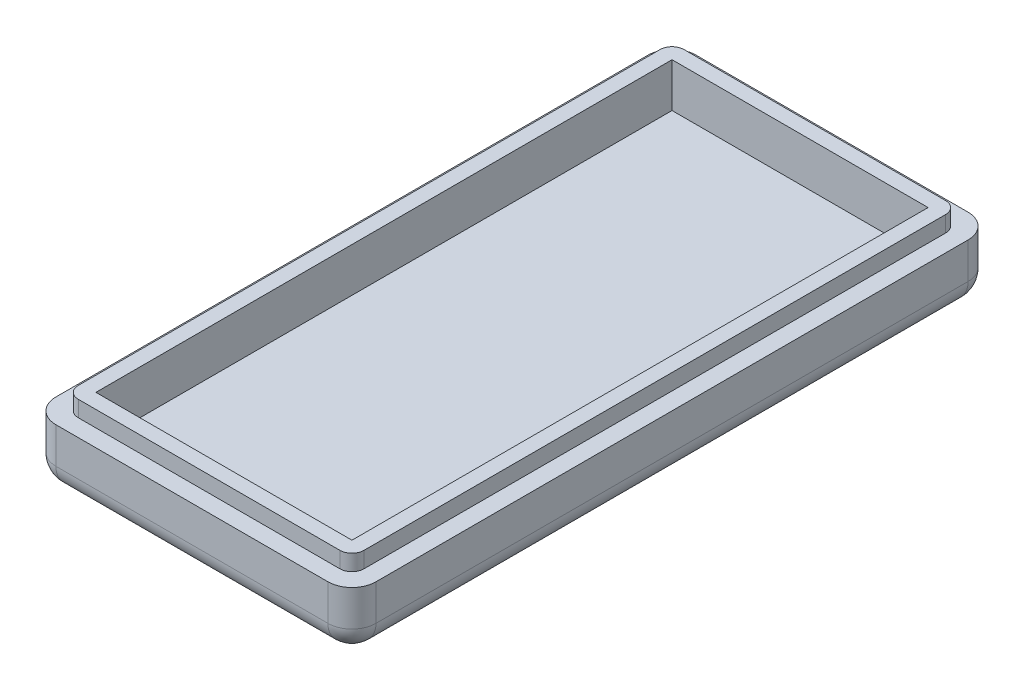
ISO-10303-21;
HEADER;
FILE_DESCRIPTION(('STEP AP214'),'2;1');
FILE_NAME('part.step','',(''),(''),'','','');
FILE_SCHEMA(('AUTOMOTIVE_DESIGN { 1 0 10303 214 1 1 1 1 }'));
ENDSEC;
DATA;
#1=APPLICATION_CONTEXT('core data for automotive mechanical design processes');
#2=APPLICATION_PROTOCOL_DEFINITION('international standard','automotive_design',2000,#1);
#3=PRODUCT_CONTEXT('',#1,'mechanical');
#4=PRODUCT('Part','Part','',(#3));
#5=PRODUCT_RELATED_PRODUCT_CATEGORY('part','',(#4));
#6=PRODUCT_DEFINITION_FORMATION('','',#4);
#7=PRODUCT_DEFINITION_CONTEXT('part definition',#1,'design');
#8=PRODUCT_DEFINITION('design','',#6,#7);
#9=PRODUCT_DEFINITION_SHAPE('','',#8);
#10=(LENGTH_UNIT() NAMED_UNIT(*) SI_UNIT(.MILLI.,.METRE.));
#11=(NAMED_UNIT(*) PLANE_ANGLE_UNIT() SI_UNIT($,.RADIAN.));
#12=(NAMED_UNIT(*) SI_UNIT($,.STERADIAN.) SOLID_ANGLE_UNIT());
#13=UNCERTAINTY_MEASURE_WITH_UNIT(LENGTH_MEASURE(1.E-05),#10,'distance_accuracy_value','');
#14=(GEOMETRIC_REPRESENTATION_CONTEXT(3) GLOBAL_UNCERTAINTY_ASSIGNED_CONTEXT((#13)) GLOBAL_UNIT_ASSIGNED_CONTEXT((#10,
#11,#12)) REPRESENTATION_CONTEXT('',''));
#15=CARTESIAN_POINT('',(0.,0.,0.));
#16=DIRECTION('',(0.,0.,1.));
#17=DIRECTION('',(1.,0.,0.));
#18=AXIS2_PLACEMENT_3D('',#15,#16,#17);
#19=CARTESIAN_POINT('',(0.,7.5,80.));
#20=DIRECTION('',(0.,-1.,0.));
#21=DIRECTION('',(0.,0.,-1.));
#22=AXIS2_PLACEMENT_3D('',#19,#20,#21);
#23=PLANE('',#22);
#24=DIRECTION('',(-1.,0.,0.));
#25=VECTOR('',#24,1.);
#26=CARTESIAN_POINT('',(0.,7.5,0.));
#27=LINE('',#26,#25);
#28=CARTESIAN_POINT('',(37.,7.5,0.));
#29=VERTEX_POINT('',#28);
#30=CARTESIAN_POINT('',(3.,7.5,0.));
#31=VERTEX_POINT('',#30);
#32=EDGE_CURVE('E283',#29,#31,#27,.T.);
#33=ORIENTED_EDGE('',*,*,#32,.T.);
#34=CARTESIAN_POINT('',(3.,7.5,3.));
#35=DIRECTION('',(0.,-1.,0.));
#36=DIRECTION('',(0.,0.,-1.));
#37=AXIS2_PLACEMENT_3D('',#34,#35,#36);
#38=CIRCLE('',#37,3.);
#39=CARTESIAN_POINT('',(0.,7.5,3.));
#40=VERTEX_POINT('',#39);
#41=EDGE_CURVE('E322',#31,#40,#38,.F.);
#42=ORIENTED_EDGE('',*,*,#41,.T.);
#43=DIRECTION('',(0.,0.,-1.));
#44=VECTOR('',#43,1.);
#45=CARTESIAN_POINT('',(0.,7.5,80.));
#46=LINE('',#45,#44);
#47=CARTESIAN_POINT('',(0.,7.5,77.));
#48=VERTEX_POINT('',#47);
#49=EDGE_CURVE('E295',#48,#40,#46,.T.);
#50=ORIENTED_EDGE('',*,*,#49,.F.);
#51=CARTESIAN_POINT('',(3.,7.5,77.));
#52=DIRECTION('',(0.,-1.,0.));
#53=DIRECTION('',(0.,0.,-1.));
#54=AXIS2_PLACEMENT_3D('',#51,#52,#53);
#55=CIRCLE('',#54,3.);
#56=CARTESIAN_POINT('',(3.,7.5,80.));
#57=VERTEX_POINT('',#56);
#58=EDGE_CURVE('E320',#48,#57,#55,.F.);
#59=ORIENTED_EDGE('',*,*,#58,.T.);
#60=DIRECTION('',(-1.,0.,0.));
#61=VECTOR('',#60,1.);
#62=CARTESIAN_POINT('',(0.,7.5,80.));
#63=LINE('',#62,#61);
#64=CARTESIAN_POINT('',(37.,7.5,80.));
#65=VERTEX_POINT('',#64);
#66=EDGE_CURVE('E292',#65,#57,#63,.T.);
#67=ORIENTED_EDGE('',*,*,#66,.F.);
#68=CARTESIAN_POINT('',(37.,7.5,77.));
#69=DIRECTION('',(0.,-1.,0.));
#70=DIRECTION('',(0.,0.,-1.));
#71=AXIS2_PLACEMENT_3D('',#68,#69,#70);
#72=CIRCLE('',#71,3.);
#73=CARTESIAN_POINT('',(40.,7.5,77.));
#74=VERTEX_POINT('',#73);
#75=EDGE_CURVE('E318',#65,#74,#72,.F.);
#76=ORIENTED_EDGE('',*,*,#75,.T.);
#77=DIRECTION('',(0.,0.,-1.));
#78=VECTOR('',#77,1.);
#79=CARTESIAN_POINT('',(40.,7.5,80.));
#80=LINE('',#79,#78);
#81=CARTESIAN_POINT('',(40.,7.5,3.));
#82=VERTEX_POINT('',#81);
#83=EDGE_CURVE('E300',#74,#82,#80,.T.);
#84=ORIENTED_EDGE('',*,*,#83,.T.);
#85=CARTESIAN_POINT('',(37.,7.5,3.));
#86=DIRECTION('',(0.,-1.,0.));
#87=DIRECTION('',(0.,0.,-1.));
#88=AXIS2_PLACEMENT_3D('',#85,#86,#87);
#89=CIRCLE('',#88,3.);
#90=EDGE_CURVE('E316',#82,#29,#89,.F.);
#91=ORIENTED_EDGE('',*,*,#90,.T.);
#92=EDGE_LOOP('',(#33,#42,#50,#59,#67,#76,#84,#91));
#93=FACE_BOUND('',#92,.T.);
#94=CARTESIAN_POINT('',(3.65,7.5,76.35));
#95=DIRECTION('',(0.,1.,0.));
#96=DIRECTION('',(0.,0.,1.));
#97=AXIS2_PLACEMENT_3D('',#94,#95,#96);
#98=CIRCLE('',#97,1.5);
#99=CARTESIAN_POINT('',(2.15,7.5,76.35));
#100=VERTEX_POINT('',#99);
#101=CARTESIAN_POINT('',(3.65,7.5,77.85));
#102=VERTEX_POINT('',#101);
#103=EDGE_CURVE('E56',#100,#102,#98,.T.);
#104=ORIENTED_EDGE('',*,*,#103,.F.);
#105=DIRECTION('',(0.,0.,1.));
#106=VECTOR('',#105,1.);
#107=CARTESIAN_POINT('',(2.14999999999999,7.5,3.65000000000001));
#108=LINE('',#107,#106);
#109=CARTESIAN_POINT('',(2.14999999999999,7.5,3.65000000000001));
#110=VERTEX_POINT('',#109);
#111=EDGE_CURVE('E60',#110,#100,#108,.T.);
#112=ORIENTED_EDGE('',*,*,#111,.F.);
#113=CARTESIAN_POINT('',(3.64999999999999,7.5,3.65000000000001));
#114=DIRECTION('',(0.,1.,0.));
#115=DIRECTION('',(0.,0.,-1.));
#116=AXIS2_PLACEMENT_3D('',#113,#114,#115);
#117=CIRCLE('',#116,1.5);
#118=CARTESIAN_POINT('',(3.64999999999999,7.5,2.15000000000001));
#119=VERTEX_POINT('',#118);
#120=EDGE_CURVE('E251',#119,#110,#117,.T.);
#121=ORIENTED_EDGE('',*,*,#120,.F.);
#122=DIRECTION('',(-1.,0.,0.));
#123=VECTOR('',#122,1.);
#124=CARTESIAN_POINT('',(36.35,7.5,2.15));
#125=LINE('',#124,#123);
#126=CARTESIAN_POINT('',(36.35,7.5,2.15));
#127=VERTEX_POINT('',#126);
#128=EDGE_CURVE('E248',#127,#119,#125,.T.);
#129=ORIENTED_EDGE('',*,*,#128,.F.);
#130=CARTESIAN_POINT('',(36.35,7.5,3.65));
#131=DIRECTION('',(0.,1.,0.));
#132=DIRECTION('',(0.,0.,-1.));
#133=AXIS2_PLACEMENT_3D('',#130,#131,#132);
#134=CIRCLE('',#133,1.5);
#135=CARTESIAN_POINT('',(37.85,7.5,3.65));
#136=VERTEX_POINT('',#135);
#137=EDGE_CURVE('E245',#136,#127,#134,.T.);
#138=ORIENTED_EDGE('',*,*,#137,.F.);
#139=DIRECTION('',(0.,0.,-1.));
#140=VECTOR('',#139,1.);
#141=CARTESIAN_POINT('',(37.85,7.5,76.35));
#142=LINE('',#141,#140);
#143=CARTESIAN_POINT('',(37.85,7.5,76.35));
#144=VERTEX_POINT('',#143);
#145=EDGE_CURVE('E242',#144,#136,#142,.T.);
#146=ORIENTED_EDGE('',*,*,#145,.F.);
#147=CARTESIAN_POINT('',(36.35,7.5,76.35));
#148=DIRECTION('',(0.,1.,0.));
#149=DIRECTION('',(0.,0.,-1.));
#150=AXIS2_PLACEMENT_3D('',#147,#148,#149);
#151=CIRCLE('',#150,1.5);
#152=CARTESIAN_POINT('',(36.35,7.5,77.85));
#153=VERTEX_POINT('',#152);
#154=EDGE_CURVE('E239',#153,#144,#151,.T.);
#155=ORIENTED_EDGE('',*,*,#154,.F.);
#156=DIRECTION('',(1.,0.,0.));
#157=VECTOR('',#156,1.);
#158=CARTESIAN_POINT('',(3.65,7.5,77.85));
#159=LINE('',#158,#157);
#160=EDGE_CURVE('E236',#102,#153,#159,.T.);
#161=ORIENTED_EDGE('',*,*,#160,.F.);
#162=EDGE_LOOP('',(#104,#112,#121,#129,#138,#146,#155,#161));
#163=FACE_BOUND('',#162,.T.);
#164=ADVANCED_FACE('F39',(#93,#163),#23,.F.);
#165=CARTESIAN_POINT('',(0.,0.,80.));
#166=DIRECTION('',(1.,0.,0.));
#167=DIRECTION('',(0.,0.,-1.));
#168=AXIS2_PLACEMENT_3D('',#165,#166,#167);
#169=PLANE('',#168);
#170=ORIENTED_EDGE('',*,*,#49,.T.);
#171=DIRECTION('',(0.,-1.,0.));
#172=VECTOR('',#171,1.);
#173=CARTESIAN_POINT('',(0.,0.,3.));
#174=LINE('',#173,#172);
#175=CARTESIAN_POINT('',(0.,3.,3.));
#176=VERTEX_POINT('',#175);
#177=EDGE_CURVE('E307',#40,#176,#174,.T.);
#178=ORIENTED_EDGE('',*,*,#177,.T.);
#179=DIRECTION('',(0.,0.,-1.));
#180=VECTOR('',#179,1.);
#181=CARTESIAN_POINT('',(0.,3.,80.));
#182=LINE('',#181,#180);
#183=CARTESIAN_POINT('',(0.,3.,77.));
#184=VERTEX_POINT('',#183);
#185=EDGE_CURVE('E303',#176,#184,#182,.F.);
#186=ORIENTED_EDGE('',*,*,#185,.T.);
#187=DIRECTION('',(0.,-1.,0.));
#188=VECTOR('',#187,1.);
#189=CARTESIAN_POINT('',(0.,0.,77.));
#190=LINE('',#189,#188);
#191=EDGE_CURVE('E305',#184,#48,#190,.F.);
#192=ORIENTED_EDGE('',*,*,#191,.T.);
#193=EDGE_LOOP('',(#170,#178,#186,#192));
#194=FACE_BOUND('',#193,.T.);
#195=ADVANCED_FACE('F440',(#194),#169,.F.);
#196=CARTESIAN_POINT('',(0.,0.,80.));
#197=DIRECTION('',(0.,1.,0.));
#198=DIRECTION('',(0.,0.,1.));
#199=AXIS2_PLACEMENT_3D('',#196,#197,#198);
#200=PLANE('',#199);
#201=DIRECTION('',(1.,0.,0.));
#202=VECTOR('',#201,1.);
#203=CARTESIAN_POINT('',(0.,0.,77.));
#204=LINE('',#203,#202);
#205=CARTESIAN_POINT('',(37.,0.,77.));
#206=VERTEX_POINT('',#205);
#207=CARTESIAN_POINT('',(3.,0.,77.));
#208=VERTEX_POINT('',#207);
#209=EDGE_CURVE('E326',#206,#208,#204,.F.);
#210=ORIENTED_EDGE('',*,*,#209,.T.);
#211=DIRECTION('',(0.,0.,-1.));
#212=VECTOR('',#211,1.);
#213=CARTESIAN_POINT('',(3.,0.,80.));
#214=LINE('',#213,#212);
#215=CARTESIAN_POINT('',(3.,0.,3.));
#216=VERTEX_POINT('',#215);
#217=EDGE_CURVE('E331',#208,#216,#214,.T.);
#218=ORIENTED_EDGE('',*,*,#217,.T.);
#219=DIRECTION('',(1.,0.,0.));
#220=VECTOR('',#219,1.);
#221=CARTESIAN_POINT('',(40.,0.,3.));
#222=LINE('',#221,#220);
#223=CARTESIAN_POINT('',(37.,0.,3.));
#224=VERTEX_POINT('',#223);
#225=EDGE_CURVE('E328',#216,#224,#222,.T.);
#226=ORIENTED_EDGE('',*,*,#225,.T.);
#227=DIRECTION('',(0.,0.,-1.));
#228=VECTOR('',#227,1.);
#229=CARTESIAN_POINT('',(37.,0.,80.));
#230=LINE('',#229,#228);
#231=EDGE_CURVE('E324',#224,#206,#230,.F.);
#232=ORIENTED_EDGE('',*,*,#231,.T.);
#233=EDGE_LOOP('',(#210,#218,#226,#232));
#234=FACE_BOUND('',#233,.T.);
#235=ADVANCED_FACE('F408',(#234),#200,.F.);
#236=CARTESIAN_POINT('',(40.,0.,80.));
#237=DIRECTION('',(-1.,0.,0.));
#238=DIRECTION('',(0.,0.,1.));
#239=AXIS2_PLACEMENT_3D('',#236,#237,#238);
#240=PLANE('',#239);
#241=ORIENTED_EDGE('',*,*,#83,.F.);
#242=DIRECTION('',(0.,1.,0.));
#243=VECTOR('',#242,1.);
#244=CARTESIAN_POINT('',(40.,0.,77.));
#245=LINE('',#244,#243);
#246=CARTESIAN_POINT('',(40.,3.,77.));
#247=VERTEX_POINT('',#246);
#248=EDGE_CURVE('E11',#74,#247,#245,.F.);
#249=ORIENTED_EDGE('',*,*,#248,.T.);
#250=DIRECTION('',(0.,0.,-1.));
#251=VECTOR('',#250,1.);
#252=CARTESIAN_POINT('',(40.,3.,80.));
#253=LINE('',#252,#251);
#254=CARTESIAN_POINT('',(40.,3.,3.));
#255=VERTEX_POINT('',#254);
#256=EDGE_CURVE('E48',#247,#255,#253,.T.);
#257=ORIENTED_EDGE('',*,*,#256,.T.);
#258=DIRECTION('',(0.,1.,0.));
#259=VECTOR('',#258,1.);
#260=CARTESIAN_POINT('',(40.,7.5,3.));
#261=LINE('',#260,#259);
#262=EDGE_CURVE('E339',#255,#82,#261,.T.);
#263=ORIENTED_EDGE('',*,*,#262,.T.);
#264=EDGE_LOOP('',(#241,#249,#257,#263));
#265=FACE_BOUND('',#264,.T.);
#266=ADVANCED_FACE('F424',(#265),#240,.F.);
#267=CARTESIAN_POINT('',(0.,0.,80.));
#268=DIRECTION('',(0.,0.,-1.));
#269=DIRECTION('',(-1.,0.,0.));
#270=AXIS2_PLACEMENT_3D('',#267,#268,#269);
#271=PLANE('',#270);
#272=ORIENTED_EDGE('',*,*,#66,.T.);
#273=DIRECTION('',(0.,-1.,0.));
#274=VECTOR('',#273,1.);
#275=CARTESIAN_POINT('',(3.,0.,80.));
#276=LINE('',#275,#274);
#277=CARTESIAN_POINT('',(3.,3.,80.));
#278=VERTEX_POINT('',#277);
#279=EDGE_CURVE('E337',#57,#278,#276,.T.);
#280=ORIENTED_EDGE('',*,*,#279,.T.);
#281=DIRECTION('',(1.,0.,0.));
#282=VECTOR('',#281,1.);
#283=CARTESIAN_POINT('',(0.,3.,80.));
#284=LINE('',#283,#282);
#285=CARTESIAN_POINT('',(37.,3.,80.));
#286=VERTEX_POINT('',#285);
#287=EDGE_CURVE('E335',#278,#286,#284,.T.);
#288=ORIENTED_EDGE('',*,*,#287,.T.);
#289=DIRECTION('',(0.,1.,0.));
#290=VECTOR('',#289,1.);
#291=CARTESIAN_POINT('',(37.,0.,80.));
#292=LINE('',#291,#290);
#293=EDGE_CURVE('E333',#286,#65,#292,.T.);
#294=ORIENTED_EDGE('',*,*,#293,.T.);
#295=EDGE_LOOP('',(#272,#280,#288,#294));
#296=FACE_BOUND('',#295,.T.);
#297=ADVANCED_FACE('F386',(#296),#271,.F.);
#298=CARTESIAN_POINT('',(0.,0.,0.));
#299=DIRECTION('',(0.,0.,-1.));
#300=DIRECTION('',(-1.,0.,0.));
#301=AXIS2_PLACEMENT_3D('',#298,#299,#300);
#302=PLANE('',#301);
#303=DIRECTION('',(1.,0.,0.));
#304=VECTOR('',#303,1.);
#305=CARTESIAN_POINT('',(0.,3.,0.));
#306=LINE('',#305,#304);
#307=CARTESIAN_POINT('',(37.,3.,0.));
#308=VERTEX_POINT('',#307);
#309=CARTESIAN_POINT('',(3.,3.,0.));
#310=VERTEX_POINT('',#309);
#311=EDGE_CURVE('E312',#308,#310,#306,.F.);
#312=ORIENTED_EDGE('',*,*,#311,.T.);
#313=DIRECTION('',(0.,-1.,0.));
#314=VECTOR('',#313,1.);
#315=CARTESIAN_POINT('',(3.,7.5,0.));
#316=LINE('',#315,#314);
#317=EDGE_CURVE('E314',#310,#31,#316,.F.);
#318=ORIENTED_EDGE('',*,*,#317,.T.);
#319=ORIENTED_EDGE('',*,*,#32,.F.);
#320=DIRECTION('',(0.,1.,0.));
#321=VECTOR('',#320,1.);
#322=CARTESIAN_POINT('',(37.,0.,0.));
#323=LINE('',#322,#321);
#324=EDGE_CURVE('E310',#29,#308,#323,.F.);
#325=ORIENTED_EDGE('',*,*,#324,.T.);
#326=EDGE_LOOP('',(#312,#318,#319,#325));
#327=FACE_BOUND('',#326,.T.);
#328=ADVANCED_FACE('F432',(#327),#302,.T.);
#329=CARTESIAN_POINT('',(37.,0.,77.));
#330=DIRECTION('',(0.,1.,0.));
#331=DIRECTION('',(0.,0.,1.));
#332=AXIS2_PLACEMENT_3D('',#329,#330,#331);
#333=CYLINDRICAL_SURFACE('',#332,3.);
#334=CARTESIAN_POINT('',(37.,3.,77.));
#335=DIRECTION('',(0.,-1.,0.));
#336=DIRECTION('',(0.,0.,-1.));
#337=AXIS2_PLACEMENT_3D('',#334,#335,#336);
#338=CIRCLE('',#337,3.);
#339=EDGE_CURVE('E43',#247,#286,#338,.T.);
#340=ORIENTED_EDGE('',*,*,#339,.F.);
#341=ORIENTED_EDGE('',*,*,#248,.F.);
#342=ORIENTED_EDGE('',*,*,#75,.F.);
#343=ORIENTED_EDGE('',*,*,#293,.F.);
#344=EDGE_LOOP('',(#340,#341,#342,#343));
#345=FACE_BOUND('',#344,.T.);
#346=ADVANCED_FACE('F41',(#345),#333,.T.);
#347=CARTESIAN_POINT('',(37.,3.,77.));
#348=DIRECTION('',(0.,0.,1.));
#349=DIRECTION('',(1.,0.,0.));
#350=AXIS2_PLACEMENT_3D('',#347,#348,#349);
#351=SPHERICAL_SURFACE('',#350,3.);
#352=CARTESIAN_POINT('',(37.,3.,77.));
#353=DIRECTION('',(0.,0.,1.));
#354=DIRECTION('',(1.,0.,0.));
#355=AXIS2_PLACEMENT_3D('',#352,#353,#354);
#356=CIRCLE('',#355,3.);
#357=EDGE_CURVE('E366',#247,#206,#356,.F.);
#358=ORIENTED_EDGE('',*,*,#357,.F.);
#359=ORIENTED_EDGE('',*,*,#339,.T.);
#360=CARTESIAN_POINT('',(37.,3.,77.));
#361=DIRECTION('',(1.,0.,0.));
#362=DIRECTION('',(0.,0.,-1.));
#363=AXIS2_PLACEMENT_3D('',#360,#361,#362);
#364=CIRCLE('',#363,3.);
#365=EDGE_CURVE('E368',#206,#286,#364,.F.);
#366=ORIENTED_EDGE('',*,*,#365,.F.);
#367=EDGE_LOOP('',(#358,#359,#366));
#368=FACE_BOUND('',#367,.T.);
#369=ADVANCED_FACE('F378',(#368),#351,.T.);
#370=CARTESIAN_POINT('',(3.,0.,77.));
#371=DIRECTION('',(0.,-1.,0.));
#372=DIRECTION('',(0.,0.,-1.));
#373=AXIS2_PLACEMENT_3D('',#370,#371,#372);
#374=CYLINDRICAL_SURFACE('',#373,3.);
#375=ORIENTED_EDGE('',*,*,#58,.F.);
#376=ORIENTED_EDGE('',*,*,#191,.F.);
#377=CARTESIAN_POINT('',(3.,3.,77.));
#378=DIRECTION('',(0.,-1.,0.));
#379=DIRECTION('',(0.,0.,-1.));
#380=AXIS2_PLACEMENT_3D('',#377,#378,#379);
#381=CIRCLE('',#380,3.);
#382=EDGE_CURVE('E363',#278,#184,#381,.T.);
#383=ORIENTED_EDGE('',*,*,#382,.F.);
#384=ORIENTED_EDGE('',*,*,#279,.F.);
#385=EDGE_LOOP('',(#375,#376,#383,#384));
#386=FACE_BOUND('',#385,.T.);
#387=ADVANCED_FACE('F394',(#386),#374,.T.);
#388=CARTESIAN_POINT('',(0.,3.,77.));
#389=DIRECTION('',(1.,0.,0.));
#390=DIRECTION('',(0.,0.,-1.));
#391=AXIS2_PLACEMENT_3D('',#388,#389,#390);
#392=CYLINDRICAL_SURFACE('',#391,3.);
#393=ORIENTED_EDGE('',*,*,#365,.T.);
#394=ORIENTED_EDGE('',*,*,#287,.F.);
#395=CARTESIAN_POINT('',(3.,3.,77.));
#396=DIRECTION('',(-1.,0.,0.));
#397=DIRECTION('',(0.,0.,1.));
#398=AXIS2_PLACEMENT_3D('',#395,#396,#397);
#399=CIRCLE('',#398,3.);
#400=EDGE_CURVE('E360',#208,#278,#399,.T.);
#401=ORIENTED_EDGE('',*,*,#400,.F.);
#402=ORIENTED_EDGE('',*,*,#209,.F.);
#403=EDGE_LOOP('',(#393,#394,#401,#402));
#404=FACE_BOUND('',#403,.T.);
#405=ADVANCED_FACE('F397',(#404),#392,.T.);
#406=CARTESIAN_POINT('',(37.,3.,80.));
#407=DIRECTION('',(0.,0.,-1.));
#408=DIRECTION('',(-1.,0.,0.));
#409=AXIS2_PLACEMENT_3D('',#406,#407,#408);
#410=CYLINDRICAL_SURFACE('',#409,3.);
#411=ORIENTED_EDGE('',*,*,#357,.T.);
#412=ORIENTED_EDGE('',*,*,#231,.F.);
#413=CARTESIAN_POINT('',(37.,3.,3.));
#414=DIRECTION('',(0.,0.,-1.));
#415=DIRECTION('',(-1.,0.,0.));
#416=AXIS2_PLACEMENT_3D('',#413,#414,#415);
#417=CIRCLE('',#416,3.);
#418=EDGE_CURVE('E357',#255,#224,#417,.T.);
#419=ORIENTED_EDGE('',*,*,#418,.F.);
#420=ORIENTED_EDGE('',*,*,#256,.F.);
#421=EDGE_LOOP('',(#411,#412,#419,#420));
#422=FACE_BOUND('',#421,.T.);
#423=ADVANCED_FACE('F421',(#422),#410,.T.);
#424=CARTESIAN_POINT('',(37.,0.,3.));
#425=DIRECTION('',(0.,-1.,0.));
#426=DIRECTION('',(0.,0.,-1.));
#427=AXIS2_PLACEMENT_3D('',#424,#425,#426);
#428=CYLINDRICAL_SURFACE('',#427,3.);
#429=ORIENTED_EDGE('',*,*,#90,.F.);
#430=ORIENTED_EDGE('',*,*,#262,.F.);
#431=CARTESIAN_POINT('',(37.,3.,3.));
#432=DIRECTION('',(0.,-1.,0.));
#433=DIRECTION('',(0.,0.,-1.));
#434=AXIS2_PLACEMENT_3D('',#431,#432,#433);
#435=CIRCLE('',#434,3.);
#436=EDGE_CURVE('E354',#308,#255,#435,.T.);
#437=ORIENTED_EDGE('',*,*,#436,.F.);
#438=ORIENTED_EDGE('',*,*,#324,.F.);
#439=EDGE_LOOP('',(#429,#430,#437,#438));
#440=FACE_BOUND('',#439,.T.);
#441=ADVANCED_FACE('F427',(#440),#428,.T.);
#442=CARTESIAN_POINT('',(3.,3.,77.));
#443=DIRECTION('',(0.,0.,1.));
#444=DIRECTION('',(1.,0.,0.));
#445=AXIS2_PLACEMENT_3D('',#442,#443,#444);
#446=SPHERICAL_SURFACE('',#445,3.);
#447=ORIENTED_EDGE('',*,*,#400,.T.);
#448=ORIENTED_EDGE('',*,*,#382,.T.);
#449=CARTESIAN_POINT('',(3.,3.,77.));
#450=DIRECTION('',(0.,0.,1.));
#451=DIRECTION('',(1.,0.,0.));
#452=AXIS2_PLACEMENT_3D('',#449,#450,#451);
#453=CIRCLE('',#452,3.);
#454=EDGE_CURVE('E351',#208,#184,#453,.F.);
#455=ORIENTED_EDGE('',*,*,#454,.F.);
#456=EDGE_LOOP('',(#447,#448,#455));
#457=FACE_BOUND('',#456,.T.);
#458=ADVANCED_FACE('F401',(#457),#446,.T.);
#459=CARTESIAN_POINT('',(37.,3.,3.));
#460=DIRECTION('',(0.,0.,1.));
#461=DIRECTION('',(1.,0.,0.));
#462=AXIS2_PLACEMENT_3D('',#459,#460,#461);
#463=SPHERICAL_SURFACE('',#462,3.);
#464=ORIENTED_EDGE('',*,*,#436,.T.);
#465=ORIENTED_EDGE('',*,*,#418,.T.);
#466=CARTESIAN_POINT('',(37.,3.,3.));
#467=DIRECTION('',(1.,0.,0.));
#468=DIRECTION('',(0.,0.,-1.));
#469=AXIS2_PLACEMENT_3D('',#466,#467,#468);
#470=CIRCLE('',#469,3.);
#471=EDGE_CURVE('E349',#308,#224,#470,.F.);
#472=ORIENTED_EDGE('',*,*,#471,.F.);
#473=EDGE_LOOP('',(#464,#465,#472));
#474=FACE_BOUND('',#473,.T.);
#475=ADVANCED_FACE('F418',(#474),#463,.T.);
#476=CARTESIAN_POINT('',(3.,3.,80.));
#477=DIRECTION('',(0.,0.,-1.));
#478=DIRECTION('',(-1.,0.,0.));
#479=AXIS2_PLACEMENT_3D('',#476,#477,#478);
#480=CYLINDRICAL_SURFACE('',#479,3.);
#481=ORIENTED_EDGE('',*,*,#454,.T.);
#482=ORIENTED_EDGE('',*,*,#185,.F.);
#483=CARTESIAN_POINT('',(3.,3.,3.));
#484=DIRECTION('',(0.,0.,-1.));
#485=DIRECTION('',(-1.,0.,0.));
#486=AXIS2_PLACEMENT_3D('',#483,#484,#485);
#487=CIRCLE('',#486,3.);
#488=EDGE_CURVE('E346',#216,#176,#487,.T.);
#489=ORIENTED_EDGE('',*,*,#488,.F.);
#490=ORIENTED_EDGE('',*,*,#217,.F.);
#491=EDGE_LOOP('',(#481,#482,#489,#490));
#492=FACE_BOUND('',#491,.T.);
#493=ADVANCED_FACE('F405',(#492),#480,.T.);
#494=CARTESIAN_POINT('',(0.,3.,3.));
#495=DIRECTION('',(-1.,0.,0.));
#496=DIRECTION('',(0.,0.,1.));
#497=AXIS2_PLACEMENT_3D('',#494,#495,#496);
#498=CYLINDRICAL_SURFACE('',#497,3.);
#499=ORIENTED_EDGE('',*,*,#471,.T.);
#500=ORIENTED_EDGE('',*,*,#225,.F.);
#501=CARTESIAN_POINT('',(3.,3.,3.));
#502=DIRECTION('',(-1.,0.,0.));
#503=DIRECTION('',(0.,0.,1.));
#504=AXIS2_PLACEMENT_3D('',#501,#502,#503);
#505=CIRCLE('',#504,3.);
#506=EDGE_CURVE('E343',#310,#216,#505,.T.);
#507=ORIENTED_EDGE('',*,*,#506,.F.);
#508=ORIENTED_EDGE('',*,*,#311,.F.);
#509=EDGE_LOOP('',(#499,#500,#507,#508));
#510=FACE_BOUND('',#509,.T.);
#511=ADVANCED_FACE('F411',(#510),#498,.T.);
#512=CARTESIAN_POINT('',(3.,3.,3.));
#513=DIRECTION('',(0.,0.,1.));
#514=DIRECTION('',(1.,0.,0.));
#515=AXIS2_PLACEMENT_3D('',#512,#513,#514);
#516=SPHERICAL_SURFACE('',#515,3.);
#517=ORIENTED_EDGE('',*,*,#506,.T.);
#518=ORIENTED_EDGE('',*,*,#488,.T.);
#519=CARTESIAN_POINT('',(3.,3.,3.));
#520=DIRECTION('',(0.,-1.,0.));
#521=DIRECTION('',(0.,0.,-1.));
#522=AXIS2_PLACEMENT_3D('',#519,#520,#521);
#523=CIRCLE('',#522,3.);
#524=EDGE_CURVE('E277',#310,#176,#523,.F.);
#525=ORIENTED_EDGE('',*,*,#524,.F.);
#526=EDGE_LOOP('',(#517,#518,#525));
#527=FACE_BOUND('',#526,.T.);
#528=ADVANCED_FACE('F438',(#527),#516,.T.);
#529=CARTESIAN_POINT('',(3.,0.,3.));
#530=DIRECTION('',(0.,1.,0.));
#531=DIRECTION('',(0.,0.,1.));
#532=AXIS2_PLACEMENT_3D('',#529,#530,#531);
#533=CYLINDRICAL_SURFACE('',#532,3.);
#534=ORIENTED_EDGE('',*,*,#41,.F.);
#535=ORIENTED_EDGE('',*,*,#317,.F.);
#536=ORIENTED_EDGE('',*,*,#524,.T.);
#537=ORIENTED_EDGE('',*,*,#177,.F.);
#538=EDGE_LOOP('',(#534,#535,#536,#537));
#539=FACE_BOUND('',#538,.T.);
#540=ADVANCED_FACE('F435',(#539),#533,.T.);
#541=CARTESIAN_POINT('',(3.65,9.5,76.35));
#542=DIRECTION('',(0.,1.,0.));
#543=DIRECTION('',(0.,0.,1.));
#544=AXIS2_PLACEMENT_3D('',#541,#542,#543);
#545=PLANE('',#544);
#546=CARTESIAN_POINT('',(3.65,9.5,76.35));
#547=DIRECTION('',(0.,1.,0.));
#548=DIRECTION('',(0.,0.,1.));
#549=AXIS2_PLACEMENT_3D('',#546,#547,#548);
#550=CIRCLE('',#549,1.5);
#551=CARTESIAN_POINT('',(2.15,9.5,76.35));
#552=VERTEX_POINT('',#551);
#553=CARTESIAN_POINT('',(3.65,9.5,77.85));
#554=VERTEX_POINT('',#553);
#555=EDGE_CURVE('E217',#552,#554,#550,.T.);
#556=ORIENTED_EDGE('',*,*,#555,.T.);
#557=DIRECTION('',(1.,0.,0.));
#558=VECTOR('',#557,1.);
#559=CARTESIAN_POINT('',(3.65,9.5,77.85));
#560=LINE('',#559,#558);
#561=CARTESIAN_POINT('',(36.35,9.5,77.85));
#562=VERTEX_POINT('',#561);
#563=EDGE_CURVE('E220',#554,#562,#560,.T.);
#564=ORIENTED_EDGE('',*,*,#563,.T.);
#565=CARTESIAN_POINT('',(36.35,9.5,76.35));
#566=DIRECTION('',(0.,1.,0.));
#567=DIRECTION('',(0.,0.,-1.));
#568=AXIS2_PLACEMENT_3D('',#565,#566,#567);
#569=CIRCLE('',#568,1.5);
#570=CARTESIAN_POINT('',(37.85,9.5,76.35));
#571=VERTEX_POINT('',#570);
#572=EDGE_CURVE('E222',#562,#571,#569,.T.);
#573=ORIENTED_EDGE('',*,*,#572,.T.);
#574=DIRECTION('',(0.,0.,-1.));
#575=VECTOR('',#574,1.);
#576=CARTESIAN_POINT('',(37.85,9.5,76.35));
#577=LINE('',#576,#575);
#578=CARTESIAN_POINT('',(37.85,9.5,3.65));
#579=VERTEX_POINT('',#578);
#580=EDGE_CURVE('E224',#571,#579,#577,.T.);
#581=ORIENTED_EDGE('',*,*,#580,.T.);
#582=CARTESIAN_POINT('',(36.35,9.5,3.65));
#583=DIRECTION('',(0.,1.,0.));
#584=DIRECTION('',(0.,0.,-1.));
#585=AXIS2_PLACEMENT_3D('',#582,#583,#584);
#586=CIRCLE('',#585,1.5);
#587=CARTESIAN_POINT('',(36.35,9.5,2.15));
#588=VERTEX_POINT('',#587);
#589=EDGE_CURVE('E226',#579,#588,#586,.T.);
#590=ORIENTED_EDGE('',*,*,#589,.T.);
#591=DIRECTION('',(-1.,0.,0.));
#592=VECTOR('',#591,1.);
#593=CARTESIAN_POINT('',(36.35,9.5,2.15));
#594=LINE('',#593,#592);
#595=CARTESIAN_POINT('',(3.64999999999999,9.5,2.15000000000001));
#596=VERTEX_POINT('',#595);
#597=EDGE_CURVE('E228',#588,#596,#594,.T.);
#598=ORIENTED_EDGE('',*,*,#597,.T.);
#599=CARTESIAN_POINT('',(3.64999999999999,9.5,3.65000000000001));
#600=DIRECTION('',(0.,1.,0.));
#601=DIRECTION('',(0.,0.,-1.));
#602=AXIS2_PLACEMENT_3D('',#599,#600,#601);
#603=CIRCLE('',#602,1.5);
#604=CARTESIAN_POINT('',(2.14999999999999,9.5,3.65000000000001));
#605=VERTEX_POINT('',#604);
#606=EDGE_CURVE('E230',#596,#605,#603,.T.);
#607=ORIENTED_EDGE('',*,*,#606,.T.);
#608=DIRECTION('',(0.,0.,1.));
#609=VECTOR('',#608,1.);
#610=CARTESIAN_POINT('',(2.14999999999999,9.5,3.65000000000001));
#611=LINE('',#610,#609);
#612=EDGE_CURVE('E232',#605,#552,#611,.T.);
#613=ORIENTED_EDGE('',*,*,#612,.T.);
#614=EDGE_LOOP('',(#556,#564,#573,#581,#590,#598,#607,#613));
#615=FACE_BOUND('',#614,.T.);
#616=DIRECTION('',(-1.,0.,0.));
#617=VECTOR('',#616,1.);
#618=CARTESIAN_POINT('',(36.,9.5,4.));
#619=LINE('',#618,#617);
#620=CARTESIAN_POINT('',(36.,9.5,4.));
#621=VERTEX_POINT('',#620);
#622=CARTESIAN_POINT('',(3.99999999999999,9.5,4.00000000000001));
#623=VERTEX_POINT('',#622);
#624=EDGE_CURVE('E192',#621,#623,#619,.T.);
#625=ORIENTED_EDGE('',*,*,#624,.F.);
#626=DIRECTION('',(0.,0.,-1.));
#627=VECTOR('',#626,1.);
#628=CARTESIAN_POINT('',(36.,9.5,76.));
#629=LINE('',#628,#627);
#630=CARTESIAN_POINT('',(36.,9.5,76.));
#631=VERTEX_POINT('',#630);
#632=EDGE_CURVE('E201',#631,#621,#629,.T.);
#633=ORIENTED_EDGE('',*,*,#632,.F.);
#634=DIRECTION('',(1.,0.,0.));
#635=VECTOR('',#634,1.);
#636=CARTESIAN_POINT('',(4.,9.5,76.));
#637=LINE('',#636,#635);
#638=CARTESIAN_POINT('',(4.,9.5,76.));
#639=VERTEX_POINT('',#638);
#640=EDGE_CURVE('E213',#639,#631,#637,.T.);
#641=ORIENTED_EDGE('',*,*,#640,.F.);
#642=DIRECTION('',(0.,0.,1.));
#643=VECTOR('',#642,1.);
#644=CARTESIAN_POINT('',(3.99999999999999,9.5,4.00000000000001));
#645=LINE('',#644,#643);
#646=EDGE_CURVE('E211',#623,#639,#645,.T.);
#647=ORIENTED_EDGE('',*,*,#646,.F.);
#648=EDGE_LOOP('',(#625,#633,#641,#647));
#649=FACE_BOUND('',#648,.T.);
#650=ADVANCED_FACE('F209',(#615,#649),#545,.T.);
#651=CARTESIAN_POINT('',(3.65,9.5,76.35));
#652=DIRECTION('',(0.,-1.,0.));
#653=DIRECTION('',(0.,0.,-1.));
#654=AXIS2_PLACEMENT_3D('',#651,#652,#653);
#655=CYLINDRICAL_SURFACE('',#654,1.5);
#656=ORIENTED_EDGE('',*,*,#103,.T.);
#657=DIRECTION('',(0.,-1.,0.));
#658=VECTOR('',#657,1.);
#659=CARTESIAN_POINT('',(3.65,9.5,77.85));
#660=LINE('',#659,#658);
#661=EDGE_CURVE('E274',#554,#102,#660,.T.);
#662=ORIENTED_EDGE('',*,*,#661,.F.);
#663=ORIENTED_EDGE('',*,*,#555,.F.);
#664=DIRECTION('',(0.,-1.,0.));
#665=VECTOR('',#664,1.);
#666=CARTESIAN_POINT('',(2.15,9.5,76.35));
#667=LINE('',#666,#665);
#668=EDGE_CURVE('E234',#552,#100,#667,.T.);
#669=ORIENTED_EDGE('',*,*,#668,.T.);
#670=EDGE_LOOP('',(#656,#662,#663,#669));
#671=FACE_BOUND('',#670,.T.);
#672=ADVANCED_FACE('F589',(#671),#655,.T.);
#673=CARTESIAN_POINT('',(3.65,9.5,77.85));
#674=DIRECTION('',(0.,0.,-1.));
#675=DIRECTION('',(-1.,0.,0.));
#676=AXIS2_PLACEMENT_3D('',#673,#674,#675);
#677=PLANE('',#676);
#678=ORIENTED_EDGE('',*,*,#160,.T.);
#679=DIRECTION('',(0.,-1.,0.));
#680=VECTOR('',#679,1.);
#681=CARTESIAN_POINT('',(36.35,9.5,77.85));
#682=LINE('',#681,#680);
#683=EDGE_CURVE('E271',#562,#153,#682,.T.);
#684=ORIENTED_EDGE('',*,*,#683,.F.);
#685=ORIENTED_EDGE('',*,*,#563,.F.);
#686=ORIENTED_EDGE('',*,*,#661,.T.);
#687=EDGE_LOOP('',(#678,#684,#685,#686));
#688=FACE_BOUND('',#687,.T.);
#689=ADVANCED_FACE('F599',(#688),#677,.F.);
#690=CARTESIAN_POINT('',(36.35,9.5,76.35));
#691=DIRECTION('',(0.,-1.,0.));
#692=DIRECTION('',(0.,0.,-1.));
#693=AXIS2_PLACEMENT_3D('',#690,#691,#692);
#694=CYLINDRICAL_SURFACE('',#693,1.5);
#695=ORIENTED_EDGE('',*,*,#154,.T.);
#696=DIRECTION('',(0.,-1.,0.));
#697=VECTOR('',#696,1.);
#698=CARTESIAN_POINT('',(37.85,9.5,76.35));
#699=LINE('',#698,#697);
#700=EDGE_CURVE('E268',#571,#144,#699,.T.);
#701=ORIENTED_EDGE('',*,*,#700,.F.);
#702=ORIENTED_EDGE('',*,*,#572,.F.);
#703=ORIENTED_EDGE('',*,*,#683,.T.);
#704=EDGE_LOOP('',(#695,#701,#702,#703));
#705=FACE_BOUND('',#704,.T.);
#706=ADVANCED_FACE('F609',(#705),#694,.T.);
#707=CARTESIAN_POINT('',(37.85,9.5,76.35));
#708=DIRECTION('',(-1.,0.,0.));
#709=DIRECTION('',(0.,0.,1.));
#710=AXIS2_PLACEMENT_3D('',#707,#708,#709);
#711=PLANE('',#710);
#712=ORIENTED_EDGE('',*,*,#145,.T.);
#713=DIRECTION('',(0.,-1.,0.));
#714=VECTOR('',#713,1.);
#715=CARTESIAN_POINT('',(37.85,9.5,3.65));
#716=LINE('',#715,#714);
#717=EDGE_CURVE('E265',#579,#136,#716,.T.);
#718=ORIENTED_EDGE('',*,*,#717,.F.);
#719=ORIENTED_EDGE('',*,*,#580,.F.);
#720=ORIENTED_EDGE('',*,*,#700,.T.);
#721=EDGE_LOOP('',(#712,#718,#719,#720));
#722=FACE_BOUND('',#721,.T.);
#723=ADVANCED_FACE('F619',(#722),#711,.F.);
#724=CARTESIAN_POINT('',(36.35,9.5,3.65));
#725=DIRECTION('',(0.,-1.,0.));
#726=DIRECTION('',(0.,0.,-1.));
#727=AXIS2_PLACEMENT_3D('',#724,#725,#726);
#728=CYLINDRICAL_SURFACE('',#727,1.5);
#729=ORIENTED_EDGE('',*,*,#137,.T.);
#730=DIRECTION('',(0.,-1.,0.));
#731=VECTOR('',#730,1.);
#732=CARTESIAN_POINT('',(36.35,9.5,2.15));
#733=LINE('',#732,#731);
#734=EDGE_CURVE('E262',#588,#127,#733,.T.);
#735=ORIENTED_EDGE('',*,*,#734,.F.);
#736=ORIENTED_EDGE('',*,*,#589,.F.);
#737=ORIENTED_EDGE('',*,*,#717,.T.);
#738=EDGE_LOOP('',(#729,#735,#736,#737));
#739=FACE_BOUND('',#738,.T.);
#740=ADVANCED_FACE('F629',(#739),#728,.T.);
#741=CARTESIAN_POINT('',(36.35,9.5,2.15));
#742=DIRECTION('',(0.,0.,1.));
#743=DIRECTION('',(1.,0.,0.));
#744=AXIS2_PLACEMENT_3D('',#741,#742,#743);
#745=PLANE('',#744);
#746=ORIENTED_EDGE('',*,*,#128,.T.);
#747=DIRECTION('',(0.,-1.,0.));
#748=VECTOR('',#747,1.);
#749=CARTESIAN_POINT('',(3.64999999999999,9.5,2.15000000000001));
#750=LINE('',#749,#748);
#751=EDGE_CURVE('E259',#596,#119,#750,.T.);
#752=ORIENTED_EDGE('',*,*,#751,.F.);
#753=ORIENTED_EDGE('',*,*,#597,.F.);
#754=ORIENTED_EDGE('',*,*,#734,.T.);
#755=EDGE_LOOP('',(#746,#752,#753,#754));
#756=FACE_BOUND('',#755,.T.);
#757=ADVANCED_FACE('F639',(#756),#745,.F.);
#758=CARTESIAN_POINT('',(3.64999999999999,9.5,3.65000000000001));
#759=DIRECTION('',(0.,-1.,0.));
#760=DIRECTION('',(0.,0.,-1.));
#761=AXIS2_PLACEMENT_3D('',#758,#759,#760);
#762=CYLINDRICAL_SURFACE('',#761,1.5);
#763=ORIENTED_EDGE('',*,*,#120,.T.);
#764=DIRECTION('',(0.,-1.,0.));
#765=VECTOR('',#764,1.);
#766=CARTESIAN_POINT('',(2.14999999999999,9.5,3.65000000000001));
#767=LINE('',#766,#765);
#768=EDGE_CURVE('E256',#605,#110,#767,.T.);
#769=ORIENTED_EDGE('',*,*,#768,.F.);
#770=ORIENTED_EDGE('',*,*,#606,.F.);
#771=ORIENTED_EDGE('',*,*,#751,.T.);
#772=EDGE_LOOP('',(#763,#769,#770,#771));
#773=FACE_BOUND('',#772,.T.);
#774=ADVANCED_FACE('F649',(#773),#762,.T.);
#775=CARTESIAN_POINT('',(2.14999999999999,9.5,3.65000000000001));
#776=DIRECTION('',(1.,0.,0.));
#777=DIRECTION('',(0.,0.,-1.));
#778=AXIS2_PLACEMENT_3D('',#775,#776,#777);
#779=PLANE('',#778);
#780=ORIENTED_EDGE('',*,*,#111,.T.);
#781=ORIENTED_EDGE('',*,*,#668,.F.);
#782=ORIENTED_EDGE('',*,*,#612,.F.);
#783=ORIENTED_EDGE('',*,*,#768,.T.);
#784=EDGE_LOOP('',(#780,#781,#782,#783));
#785=FACE_BOUND('',#784,.T.);
#786=ADVANCED_FACE('F659',(#785),#779,.F.);
#787=CARTESIAN_POINT('',(0.,4.,80.));
#788=DIRECTION('',(0.,1.,0.));
#789=DIRECTION('',(0.,0.,1.));
#790=AXIS2_PLACEMENT_3D('',#787,#788,#789);
#791=PLANE('',#790);
#792=DIRECTION('',(1.,0.,0.));
#793=VECTOR('',#792,1.);
#794=CARTESIAN_POINT('',(0.,4.,4.));
#795=LINE('',#794,#793);
#796=CARTESIAN_POINT('',(4.,4.,4.));
#797=VERTEX_POINT('',#796);
#798=CARTESIAN_POINT('',(36.,4.,4.));
#799=VERTEX_POINT('',#798);
#800=EDGE_CURVE('E194',#797,#799,#795,.T.);
#801=ORIENTED_EDGE('',*,*,#800,.F.);
#802=DIRECTION('',(0.,0.,-1.));
#803=VECTOR('',#802,1.);
#804=CARTESIAN_POINT('',(4.,4.,80.));
#805=LINE('',#804,#803);
#806=CARTESIAN_POINT('',(4.,4.,76.));
#807=VERTEX_POINT('',#806);
#808=EDGE_CURVE('E280',#807,#797,#805,.T.);
#809=ORIENTED_EDGE('',*,*,#808,.F.);
#810=DIRECTION('',(1.,0.,0.));
#811=VECTOR('',#810,1.);
#812=CARTESIAN_POINT('',(0.,4.,76.));
#813=LINE('',#812,#811);
#814=CARTESIAN_POINT('',(36.,4.,76.));
#815=VERTEX_POINT('',#814);
#816=EDGE_CURVE('E287',#807,#815,#813,.T.);
#817=ORIENTED_EDGE('',*,*,#816,.T.);
#818=DIRECTION('',(0.,0.,-1.));
#819=VECTOR('',#818,1.);
#820=CARTESIAN_POINT('',(36.,4.,80.));
#821=LINE('',#820,#819);
#822=EDGE_CURVE('E284',#815,#799,#821,.T.);
#823=ORIENTED_EDGE('',*,*,#822,.T.);
#824=EDGE_LOOP('',(#801,#809,#817,#823));
#825=FACE_BOUND('',#824,.T.);
#826=ADVANCED_FACE('F669',(#825),#791,.T.);
#827=CARTESIAN_POINT('',(4.,0.,80.));
#828=DIRECTION('',(1.,0.,0.));
#829=DIRECTION('',(0.,0.,-1.));
#830=AXIS2_PLACEMENT_3D('',#827,#828,#829);
#831=PLANE('',#830);
#832=DIRECTION('',(0.,-1.,0.));
#833=VECTOR('',#832,1.);
#834=CARTESIAN_POINT('',(4.,0.,4.));
#835=LINE('',#834,#833);
#836=EDGE_CURVE('E278',#623,#797,#835,.T.);
#837=ORIENTED_EDGE('',*,*,#836,.F.);
#838=ORIENTED_EDGE('',*,*,#646,.T.);
#839=DIRECTION('',(0.,-1.,0.));
#840=VECTOR('',#839,1.);
#841=CARTESIAN_POINT('',(4.,0.,76.));
#842=LINE('',#841,#840);
#843=EDGE_CURVE('E198',#639,#807,#842,.T.);
#844=ORIENTED_EDGE('',*,*,#843,.T.);
#845=ORIENTED_EDGE('',*,*,#808,.T.);
#846=EDGE_LOOP('',(#837,#838,#844,#845));
#847=FACE_BOUND('',#846,.T.);
#848=ADVANCED_FACE('F676',(#847),#831,.T.);
#849=CARTESIAN_POINT('',(0.,0.,76.));
#850=DIRECTION('',(0.,0.,-1.));
#851=DIRECTION('',(-1.,0.,0.));
#852=AXIS2_PLACEMENT_3D('',#849,#850,#851);
#853=PLANE('',#852);
#854=ORIENTED_EDGE('',*,*,#843,.F.);
#855=ORIENTED_EDGE('',*,*,#640,.T.);
#856=DIRECTION('',(0.,1.,0.));
#857=VECTOR('',#856,1.);
#858=CARTESIAN_POINT('',(36.,0.,76.));
#859=LINE('',#858,#857);
#860=EDGE_CURVE('E204',#815,#631,#859,.T.);
#861=ORIENTED_EDGE('',*,*,#860,.F.);
#862=ORIENTED_EDGE('',*,*,#816,.F.);
#863=EDGE_LOOP('',(#854,#855,#861,#862));
#864=FACE_BOUND('',#863,.T.);
#865=ADVANCED_FACE('F681',(#864),#853,.T.);
#866=CARTESIAN_POINT('',(36.,0.,80.));
#867=DIRECTION('',(-1.,0.,0.));
#868=DIRECTION('',(0.,0.,1.));
#869=AXIS2_PLACEMENT_3D('',#866,#867,#868);
#870=PLANE('',#869);
#871=DIRECTION('',(0.,1.,0.));
#872=VECTOR('',#871,1.);
#873=CARTESIAN_POINT('',(36.,0.,4.));
#874=LINE('',#873,#872);
#875=EDGE_CURVE('E187',#799,#621,#874,.T.);
#876=ORIENTED_EDGE('',*,*,#875,.F.);
#877=ORIENTED_EDGE('',*,*,#822,.F.);
#878=ORIENTED_EDGE('',*,*,#860,.T.);
#879=ORIENTED_EDGE('',*,*,#632,.T.);
#880=EDGE_LOOP('',(#876,#877,#878,#879));
#881=FACE_BOUND('',#880,.T.);
#882=ADVANCED_FACE('F202',(#881),#870,.T.);
#883=CARTESIAN_POINT('',(0.,0.,4.));
#884=DIRECTION('',(0.,0.,-1.));
#885=DIRECTION('',(-1.,0.,0.));
#886=AXIS2_PLACEMENT_3D('',#883,#884,#885);
#887=PLANE('',#886);
#888=ORIENTED_EDGE('',*,*,#836,.T.);
#889=ORIENTED_EDGE('',*,*,#800,.T.);
#890=ORIENTED_EDGE('',*,*,#875,.T.);
#891=ORIENTED_EDGE('',*,*,#624,.T.);
#892=EDGE_LOOP('',(#888,#889,#890,#891));
#893=FACE_BOUND('',#892,.T.);
#894=ADVANCED_FACE('F190',(#893),#887,.F.);
#895=CLOSED_SHELL('',(#164,#195,#235,#266,#297,#328,#346,#369,#387,#405,#423,#441,#458,#475,
#493,#511,#528,#540,#650,#672,#689,#706,#723,#740,#757,#774,#786,#826,#848,#865,#882,#894));
#896=MANIFOLD_SOLID_BREP('B2',#895);
#897=ADVANCED_BREP_SHAPE_REPRESENTATION('',(#18,#896),#14);
#898=SHAPE_DEFINITION_REPRESENTATION(#9,#897);
ENDSEC;
END-ISO-10303-21;
